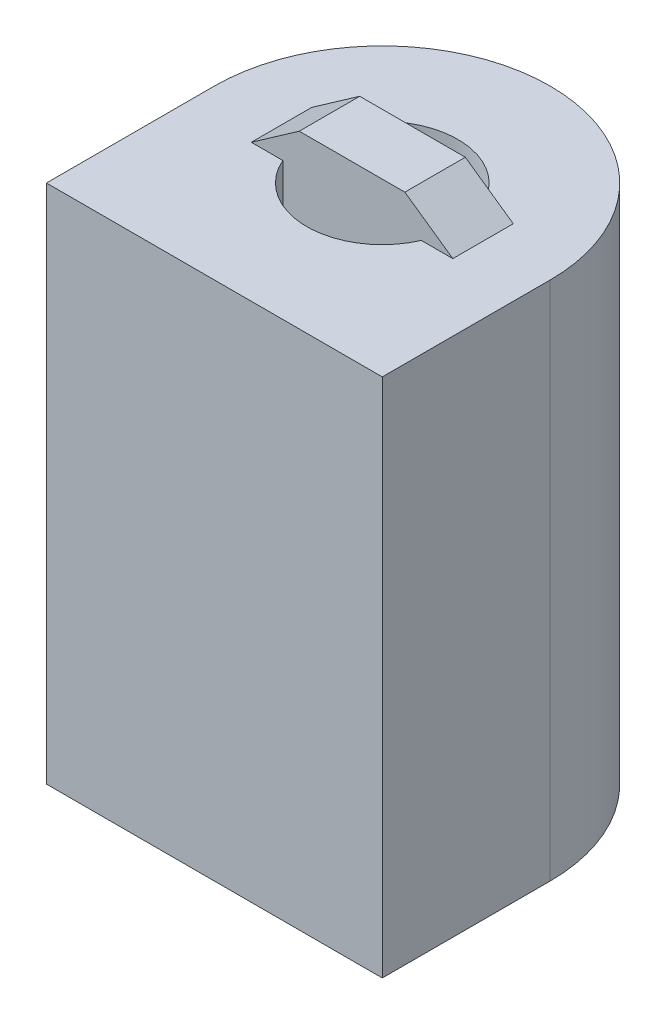
ISO-10303-21;
HEADER;
FILE_DESCRIPTION(('STEP AP214'),'2;1');
FILE_NAME('part.step','',(''),(''),'','','');
FILE_SCHEMA(('AUTOMOTIVE_DESIGN { 1 0 10303 214 1 1 1 1 }'));
ENDSEC;
DATA;
#1=APPLICATION_CONTEXT('core data for automotive mechanical design processes');
#2=APPLICATION_PROTOCOL_DEFINITION('international standard','automotive_design',2000,#1);
#3=PRODUCT_CONTEXT('',#1,'mechanical');
#4=PRODUCT('Part','Part','',(#3));
#5=PRODUCT_RELATED_PRODUCT_CATEGORY('part','',(#4));
#6=PRODUCT_DEFINITION_FORMATION('','',#4);
#7=PRODUCT_DEFINITION_CONTEXT('part definition',#1,'design');
#8=PRODUCT_DEFINITION('design','',#6,#7);
#9=PRODUCT_DEFINITION_SHAPE('','',#8);
#10=(LENGTH_UNIT() NAMED_UNIT(*) SI_UNIT(.MILLI.,.METRE.));
#11=(NAMED_UNIT(*) PLANE_ANGLE_UNIT() SI_UNIT($,.RADIAN.));
#12=(NAMED_UNIT(*) SI_UNIT($,.STERADIAN.) SOLID_ANGLE_UNIT());
#13=UNCERTAINTY_MEASURE_WITH_UNIT(LENGTH_MEASURE(1.E-05),#10,'distance_accuracy_value','');
#14=(GEOMETRIC_REPRESENTATION_CONTEXT(3) GLOBAL_UNCERTAINTY_ASSIGNED_CONTEXT((#13)) GLOBAL_UNIT_ASSIGNED_CONTEXT((#10,
#11,#12)) REPRESENTATION_CONTEXT('',''));
#15=CARTESIAN_POINT('',(0.,0.,0.));
#16=DIRECTION('',(0.,0.,1.));
#17=DIRECTION('',(1.,0.,0.));
#18=AXIS2_PLACEMENT_3D('',#15,#16,#17);
#19=CARTESIAN_POINT('',(0.,38.1,0.));
#20=DIRECTION('',(0.,-1.,0.));
#21=DIRECTION('',(0.,0.,-1.));
#22=AXIS2_PLACEMENT_3D('',#19,#20,#21);
#23=CYLINDRICAL_SURFACE('',#22,12.7);
#24=DIRECTION('',(0.,1.,0.));
#25=VECTOR('',#24,1.);
#26=CARTESIAN_POINT('',(-12.7,-17.9605122421383,0.));
#27=LINE('',#26,#25);
#28=CARTESIAN_POINT('',(-12.7,0.,0.));
#29=VERTEX_POINT('',#28);
#30=CARTESIAN_POINT('',(-12.7,39.37,0.));
#31=VERTEX_POINT('',#30);
#32=EDGE_CURVE('E83',#29,#31,#27,.T.);
#33=ORIENTED_EDGE('',*,*,#32,.T.);
#34=CARTESIAN_POINT('',(0.,39.37,0.));
#35=DIRECTION('',(0.,1.,0.));
#36=DIRECTION('',(0.,0.,1.));
#37=AXIS2_PLACEMENT_3D('',#34,#35,#36);
#38=CIRCLE('',#37,12.7);
#39=CARTESIAN_POINT('',(12.7,39.37,0.));
#40=VERTEX_POINT('',#39);
#41=EDGE_CURVE('E270',#40,#31,#38,.T.);
#42=ORIENTED_EDGE('',*,*,#41,.F.);
#43=DIRECTION('',(0.,1.,0.));
#44=VECTOR('',#43,1.);
#45=CARTESIAN_POINT('',(12.7,-17.9605122421383,0.));
#46=LINE('',#45,#44);
#47=CARTESIAN_POINT('',(12.7,0.,0.));
#48=VERTEX_POINT('',#47);
#49=EDGE_CURVE('E164',#48,#40,#46,.T.);
#50=ORIENTED_EDGE('',*,*,#49,.F.);
#51=CARTESIAN_POINT('',(0.,0.,0.));
#52=DIRECTION('',(0.,1.,0.));
#53=DIRECTION('',(0.,0.,1.));
#54=AXIS2_PLACEMENT_3D('',#51,#52,#53);
#55=CIRCLE('',#54,12.7);
#56=EDGE_CURVE('E88',#48,#29,#55,.T.);
#57=ORIENTED_EDGE('',*,*,#56,.T.);
#58=EDGE_LOOP('',(#33,#42,#50,#57));
#59=FACE_BOUND('',#58,.T.);
#60=ADVANCED_FACE('F65',(#59),#23,.T.);
#61=CARTESIAN_POINT('',(0.,39.37,0.));
#62=DIRECTION('',(0.,1.,0.));
#63=DIRECTION('',(0.,0.,1.));
#64=AXIS2_PLACEMENT_3D('',#61,#62,#63);
#65=PLANE('',#64);
#66=ORIENTED_EDGE('',*,*,#41,.T.);
#67=DIRECTION('',(0.,0.,1.));
#68=VECTOR('',#67,1.);
#69=CARTESIAN_POINT('',(-12.7,39.37,0.));
#70=LINE('',#69,#68);
#71=CARTESIAN_POINT('',(-12.7,39.37,12.7));
#72=VERTEX_POINT('',#71);
#73=EDGE_CURVE('E174',#31,#72,#70,.T.);
#74=ORIENTED_EDGE('',*,*,#73,.T.);
#75=DIRECTION('',(1.,0.,0.));
#76=VECTOR('',#75,1.);
#77=CARTESIAN_POINT('',(0.,39.37,12.7));
#78=LINE('',#77,#76);
#79=CARTESIAN_POINT('',(12.7,39.37,12.7));
#80=VERTEX_POINT('',#79);
#81=EDGE_CURVE('E173',#72,#80,#78,.T.);
#82=ORIENTED_EDGE('',*,*,#81,.T.);
#83=DIRECTION('',(0.,0.,-1.));
#84=VECTOR('',#83,1.);
#85=CARTESIAN_POINT('',(12.7,39.37,0.));
#86=LINE('',#85,#84);
#87=EDGE_CURVE('E187',#80,#40,#86,.T.);
#88=ORIENTED_EDGE('',*,*,#87,.T.);
#89=EDGE_LOOP('',(#66,#74,#82,#88));
#90=FACE_BOUND('',#89,.T.);
#91=DIRECTION('',(0.,0.,-1.));
#92=VECTOR('',#91,1.);
#93=CARTESIAN_POINT('',(7.62,39.37,17.7362168269575));
#94=LINE('',#93,#92);
#95=CARTESIAN_POINT('',(7.62,39.37,2.286));
#96=VERTEX_POINT('',#95);
#97=CARTESIAN_POINT('',(7.62,39.37,-2.286));
#98=VERTEX_POINT('',#97);
#99=EDGE_CURVE('E221',#96,#98,#94,.T.);
#100=ORIENTED_EDGE('',*,*,#99,.F.);
#101=DIRECTION('',(-1.,0.,0.));
#102=VECTOR('',#101,1.);
#103=CARTESIAN_POINT('',(-7.62,39.37,2.286));
#104=LINE('',#103,#102);
#105=CARTESIAN_POINT('',(5.23788401933452,39.37,2.286));
#106=VERTEX_POINT('',#105);
#107=EDGE_CURVE('E76',#96,#106,#104,.T.);
#108=ORIENTED_EDGE('',*,*,#107,.T.);
#109=CARTESIAN_POINT('',(0.,39.37,0.));
#110=DIRECTION('',(0.,1.,0.));
#111=DIRECTION('',(0.,0.,1.));
#112=AXIS2_PLACEMENT_3D('',#109,#110,#111);
#113=CIRCLE('',#112,5.715);
#114=CARTESIAN_POINT('',(-5.23788401933452,39.37,2.286));
#115=VERTEX_POINT('',#114);
#116=EDGE_CURVE('E265',#115,#106,#113,.T.);
#117=ORIENTED_EDGE('',*,*,#116,.F.);
#118=CARTESIAN_POINT('',(-7.62,39.37,2.286));
#119=VERTEX_POINT('',#118);
#120=EDGE_CURVE('E12',#115,#119,#104,.T.);
#121=ORIENTED_EDGE('',*,*,#120,.T.);
#122=DIRECTION('',(0.,0.,-1.));
#123=VECTOR('',#122,1.);
#124=CARTESIAN_POINT('',(-7.62,39.37,17.7362168269575));
#125=LINE('',#124,#123);
#126=CARTESIAN_POINT('',(-7.62,39.37,-2.286));
#127=VERTEX_POINT('',#126);
#128=EDGE_CURVE('E216',#119,#127,#125,.T.);
#129=ORIENTED_EDGE('',*,*,#128,.T.);
#130=DIRECTION('',(-1.,0.,0.));
#131=VECTOR('',#130,1.);
#132=CARTESIAN_POINT('',(-7.62,39.37,-2.286));
#133=LINE('',#132,#131);
#134=CARTESIAN_POINT('',(-5.23788401933452,39.37,-2.286));
#135=VERTEX_POINT('',#134);
#136=EDGE_CURVE('E74',#135,#127,#133,.T.);
#137=ORIENTED_EDGE('',*,*,#136,.F.);
#138=CARTESIAN_POINT('',(5.23788401933452,39.37,-2.286));
#139=VERTEX_POINT('',#138);
#140=EDGE_CURVE('E269',#139,#135,#113,.T.);
#141=ORIENTED_EDGE('',*,*,#140,.F.);
#142=EDGE_CURVE('E208',#98,#139,#133,.T.);
#143=ORIENTED_EDGE('',*,*,#142,.F.);
#144=EDGE_LOOP('',(#100,#108,#117,#121,#129,#137,#141,#143));
#145=FACE_BOUND('',#144,.T.);
#146=ADVANCED_FACE('F291',(#90,#145),#65,.T.);
#147=CARTESIAN_POINT('',(0.,0.,0.));
#148=DIRECTION('',(0.,1.,0.));
#149=DIRECTION('',(0.,0.,1.));
#150=AXIS2_PLACEMENT_3D('',#147,#148,#149);
#151=CYLINDRICAL_SURFACE('',#150,5.715);
#152=ORIENTED_EDGE('',*,*,#140,.T.);
#153=DIRECTION('',(0.,1.,0.));
#154=VECTOR('',#153,1.);
#155=CARTESIAN_POINT('',(-5.23788401933452,0.,-2.286));
#156=LINE('',#155,#154);
#157=CARTESIAN_POINT('',(-5.23788401933452,33.02,-2.286));
#158=VERTEX_POINT('',#157);
#159=EDGE_CURVE('E261',#135,#158,#156,.F.);
#160=ORIENTED_EDGE('',*,*,#159,.T.);
#161=CARTESIAN_POINT('',(0.,33.02,0.));
#162=DIRECTION('',(0.,-1.,0.));
#163=DIRECTION('',(0.,0.,-1.));
#164=AXIS2_PLACEMENT_3D('',#161,#162,#163);
#165=CIRCLE('',#164,5.715);
#166=CARTESIAN_POINT('',(-5.23788401933452,33.02,2.286));
#167=VERTEX_POINT('',#166);
#168=EDGE_CURVE('E455',#158,#167,#165,.F.);
#169=ORIENTED_EDGE('',*,*,#168,.T.);
#170=DIRECTION('',(0.,1.,0.));
#171=VECTOR('',#170,1.);
#172=CARTESIAN_POINT('',(-5.23788401933452,0.,2.286));
#173=LINE('',#172,#171);
#174=EDGE_CURVE('E249',#167,#115,#173,.T.);
#175=ORIENTED_EDGE('',*,*,#174,.T.);
#176=ORIENTED_EDGE('',*,*,#116,.T.);
#177=DIRECTION('',(0.,1.,0.));
#178=VECTOR('',#177,1.);
#179=CARTESIAN_POINT('',(5.23788401933452,0.,2.286));
#180=LINE('',#179,#178);
#181=CARTESIAN_POINT('',(5.23788401933452,33.02,2.286));
#182=VERTEX_POINT('',#181);
#183=EDGE_CURVE('E253',#106,#182,#180,.F.);
#184=ORIENTED_EDGE('',*,*,#183,.T.);
#185=CARTESIAN_POINT('',(5.23788401933452,33.02,-2.286));
#186=VERTEX_POINT('',#185);
#187=EDGE_CURVE('E68',#182,#186,#165,.F.);
#188=ORIENTED_EDGE('',*,*,#187,.T.);
#189=DIRECTION('',(0.,1.,0.));
#190=VECTOR('',#189,1.);
#191=CARTESIAN_POINT('',(5.23788401933452,0.,-2.286));
#192=LINE('',#191,#190);
#193=EDGE_CURVE('E257',#186,#139,#192,.T.);
#194=ORIENTED_EDGE('',*,*,#193,.T.);
#195=EDGE_LOOP('',(#152,#160,#169,#175,#176,#184,#188,#194));
#196=FACE_BOUND('',#195,.T.);
#197=CARTESIAN_POINT('',(0.,12.7,0.));
#198=DIRECTION('',(0.,-1.,0.));
#199=DIRECTION('',(0.,0.,-1.));
#200=AXIS2_PLACEMENT_3D('',#197,#198,#199);
#201=CIRCLE('',#200,5.715);
#202=CARTESIAN_POINT('',(0.,12.7,-5.715));
#203=VERTEX_POINT('',#202);
#204=EDGE_CURVE('E278',#203,#203,#201,.F.);
#205=ORIENTED_EDGE('',*,*,#204,.F.);
#206=EDGE_LOOP('',(#205));
#207=FACE_BOUND('',#206,.T.);
#208=ADVANCED_FACE('F289',(#196,#207),#151,.F.);
#209=CARTESIAN_POINT('',(0.,0.,0.));
#210=DIRECTION('',(0.,1.,0.));
#211=DIRECTION('',(0.,0.,1.));
#212=AXIS2_PLACEMENT_3D('',#209,#210,#211);
#213=PLANE('',#212);
#214=CARTESIAN_POINT('',(0.,0.,0.));
#215=DIRECTION('',(0.,-1.,0.));
#216=DIRECTION('',(0.,0.,-1.));
#217=AXIS2_PLACEMENT_3D('',#214,#215,#216);
#218=CIRCLE('',#217,9.3345);
#219=CARTESIAN_POINT('',(0.,0.,-9.3345));
#220=VERTEX_POINT('',#219);
#221=EDGE_CURVE('E273',#220,#220,#218,.T.);
#222=ORIENTED_EDGE('',*,*,#221,.F.);
#223=EDGE_LOOP('',(#222));
#224=FACE_BOUND('',#223,.T.);
#225=ORIENTED_EDGE('',*,*,#56,.F.);
#226=DIRECTION('',(0.,0.,1.));
#227=VECTOR('',#226,1.);
#228=CARTESIAN_POINT('',(12.7,0.,0.));
#229=LINE('',#228,#227);
#230=CARTESIAN_POINT('',(12.7,0.,12.7));
#231=VERTEX_POINT('',#230);
#232=EDGE_CURVE('E159',#48,#231,#229,.T.);
#233=ORIENTED_EDGE('',*,*,#232,.T.);
#234=DIRECTION('',(-1.,0.,0.));
#235=VECTOR('',#234,1.);
#236=CARTESIAN_POINT('',(0.,0.,12.7));
#237=LINE('',#236,#235);
#238=CARTESIAN_POINT('',(-12.7,0.,12.7));
#239=VERTEX_POINT('',#238);
#240=EDGE_CURVE('E154',#231,#239,#237,.T.);
#241=ORIENTED_EDGE('',*,*,#240,.T.);
#242=DIRECTION('',(0.,0.,-1.));
#243=VECTOR('',#242,1.);
#244=CARTESIAN_POINT('',(-12.7,0.,0.));
#245=LINE('',#244,#243);
#246=EDGE_CURVE('E157',#239,#29,#245,.T.);
#247=ORIENTED_EDGE('',*,*,#246,.T.);
#248=EDGE_LOOP('',(#225,#233,#241,#247));
#249=FACE_BOUND('',#248,.T.);
#250=ADVANCED_FACE('F156',(#224,#249),#213,.F.);
#251=CARTESIAN_POINT('',(0.,12.7,0.));
#252=DIRECTION('',(0.,-1.,0.));
#253=DIRECTION('',(0.,0.,-1.));
#254=AXIS2_PLACEMENT_3D('',#251,#252,#253);
#255=PLANE('',#254);
#256=CARTESIAN_POINT('',(0.,12.7,0.));
#257=DIRECTION('',(0.,-1.,0.));
#258=DIRECTION('',(0.,0.,-1.));
#259=AXIS2_PLACEMENT_3D('',#256,#257,#258);
#260=CIRCLE('',#259,9.3345);
#261=CARTESIAN_POINT('',(0.,12.7,-9.3345));
#262=VERTEX_POINT('',#261);
#263=EDGE_CURVE('E274',#262,#262,#260,.T.);
#264=ORIENTED_EDGE('',*,*,#263,.T.);
#265=EDGE_LOOP('',(#264));
#266=FACE_BOUND('',#265,.T.);
#267=ORIENTED_EDGE('',*,*,#204,.T.);
#268=EDGE_LOOP('',(#267));
#269=FACE_BOUND('',#268,.T.);
#270=ADVANCED_FACE('F287',(#266,#269),#255,.T.);
#271=CARTESIAN_POINT('',(0.,12.7,0.));
#272=DIRECTION('',(0.,-1.,0.));
#273=DIRECTION('',(0.,0.,-1.));
#274=AXIS2_PLACEMENT_3D('',#271,#272,#273);
#275=CYLINDRICAL_SURFACE('',#274,9.3345);
#276=ORIENTED_EDGE('',*,*,#263,.F.);
#277=EDGE_LOOP('',(#276));
#278=FACE_BOUND('',#277,.T.);
#279=ORIENTED_EDGE('',*,*,#221,.T.);
#280=EDGE_LOOP('',(#279));
#281=FACE_BOUND('',#280,.T.);
#282=ADVANCED_FACE('F414',(#278,#281),#275,.F.);
#283=CARTESIAN_POINT('',(0.,33.02,0.));
#284=DIRECTION('',(0.,-1.,0.));
#285=DIRECTION('',(0.,0.,-1.));
#286=AXIS2_PLACEMENT_3D('',#283,#284,#285);
#287=PLANE('',#286);
#288=ORIENTED_EDGE('',*,*,#168,.F.);
#289=DIRECTION('',(-1.,0.,0.));
#290=VECTOR('',#289,1.);
#291=CARTESIAN_POINT('',(5.715,33.02,-2.286));
#292=LINE('',#291,#290);
#293=EDGE_CURVE('E245',#186,#158,#292,.T.);
#294=ORIENTED_EDGE('',*,*,#293,.F.);
#295=ORIENTED_EDGE('',*,*,#187,.F.);
#296=DIRECTION('',(1.,0.,0.));
#297=VECTOR('',#296,1.);
#298=CARTESIAN_POINT('',(5.715,33.02,2.286));
#299=LINE('',#298,#297);
#300=EDGE_CURVE('E241',#167,#182,#299,.T.);
#301=ORIENTED_EDGE('',*,*,#300,.F.);
#302=EDGE_LOOP('',(#288,#294,#295,#301));
#303=FACE_BOUND('',#302,.T.);
#304=ADVANCED_FACE('F406',(#303),#287,.T.);
#305=CARTESIAN_POINT('',(5.715,33.02,-2.286));
#306=DIRECTION('',(0.,0.,-1.));
#307=DIRECTION('',(-1.,0.,0.));
#308=AXIS2_PLACEMENT_3D('',#305,#306,#307);
#309=PLANE('',#308);
#310=ORIENTED_EDGE('',*,*,#159,.F.);
#311=ORIENTED_EDGE('',*,*,#136,.T.);
#312=DIRECTION('',(0.819152044288995,0.573576436351041,0.));
#313=VECTOR('',#312,1.);
#314=CARTESIAN_POINT('',(-3.99250406287499,41.91,-2.286));
#315=LINE('',#314,#313);
#316=CARTESIAN_POINT('',(-3.99250406287499,41.91,-2.286));
#317=VERTEX_POINT('',#316);
#318=EDGE_CURVE('E204',#127,#317,#315,.T.);
#319=ORIENTED_EDGE('',*,*,#318,.T.);
#320=DIRECTION('',(1.,0.,0.));
#321=VECTOR('',#320,1.);
#322=CARTESIAN_POINT('',(3.99250406287499,41.91,-2.286));
#323=LINE('',#322,#321);
#324=CARTESIAN_POINT('',(3.99250406287499,41.91,-2.286));
#325=VERTEX_POINT('',#324);
#326=EDGE_CURVE('E200',#317,#325,#323,.T.);
#327=ORIENTED_EDGE('',*,*,#326,.T.);
#328=DIRECTION('',(0.819152044288995,-0.573576436351042,0.));
#329=VECTOR('',#328,1.);
#330=CARTESIAN_POINT('',(7.62,39.37,-2.286));
#331=LINE('',#330,#329);
#332=EDGE_CURVE('E199',#325,#98,#331,.T.);
#333=ORIENTED_EDGE('',*,*,#332,.T.);
#334=ORIENTED_EDGE('',*,*,#142,.T.);
#335=ORIENTED_EDGE('',*,*,#193,.F.);
#336=ORIENTED_EDGE('',*,*,#293,.T.);
#337=EDGE_LOOP('',(#310,#311,#319,#327,#333,#334,#335,#336));
#338=FACE_BOUND('',#337,.T.);
#339=ADVANCED_FACE('F398',(#338),#309,.T.);
#340=CARTESIAN_POINT('',(5.715,33.02,2.286));
#341=DIRECTION('',(0.,0.,1.));
#342=DIRECTION('',(1.,0.,0.));
#343=AXIS2_PLACEMENT_3D('',#340,#341,#342);
#344=PLANE('',#343);
#345=ORIENTED_EDGE('',*,*,#183,.F.);
#346=ORIENTED_EDGE('',*,*,#107,.F.);
#347=DIRECTION('',(0.819152044288995,-0.573576436351042,0.));
#348=VECTOR('',#347,1.);
#349=CARTESIAN_POINT('',(7.62,39.37,2.286));
#350=LINE('',#349,#348);
#351=CARTESIAN_POINT('',(3.99250406287499,41.91,2.286));
#352=VERTEX_POINT('',#351);
#353=EDGE_CURVE('E217',#352,#96,#350,.T.);
#354=ORIENTED_EDGE('',*,*,#353,.F.);
#355=DIRECTION('',(1.,0.,0.));
#356=VECTOR('',#355,1.);
#357=CARTESIAN_POINT('',(3.99250406287499,41.91,2.286));
#358=LINE('',#357,#356);
#359=CARTESIAN_POINT('',(-3.99250406287499,41.91,2.286));
#360=VERTEX_POINT('',#359);
#361=EDGE_CURVE('E223',#360,#352,#358,.T.);
#362=ORIENTED_EDGE('',*,*,#361,.F.);
#363=DIRECTION('',(0.819152044288995,0.573576436351042,0.));
#364=VECTOR('',#363,1.);
#365=CARTESIAN_POINT('',(-3.99250406287499,41.91,2.286));
#366=LINE('',#365,#364);
#367=EDGE_CURVE('E228',#119,#360,#366,.T.);
#368=ORIENTED_EDGE('',*,*,#367,.F.);
#369=ORIENTED_EDGE('',*,*,#120,.F.);
#370=ORIENTED_EDGE('',*,*,#174,.F.);
#371=ORIENTED_EDGE('',*,*,#300,.T.);
#372=EDGE_LOOP('',(#345,#346,#354,#362,#368,#369,#370,#371));
#373=FACE_BOUND('',#372,.T.);
#374=ADVANCED_FACE('F379',(#373),#344,.T.);
#375=CARTESIAN_POINT('',(-3.99250406287499,41.91,17.7362168269575));
#376=DIRECTION('',(-0.573576436351041,0.819152044288995,0.));
#377=DIRECTION('',(-0.819152044288995,-0.573576436351042,0.));
#378=AXIS2_PLACEMENT_3D('',#375,#376,#377);
#379=PLANE('',#378);
#380=ORIENTED_EDGE('',*,*,#128,.F.);
#381=ORIENTED_EDGE('',*,*,#367,.T.);
#382=DIRECTION('',(0.,0.,-1.));
#383=VECTOR('',#382,1.);
#384=CARTESIAN_POINT('',(-3.99250406287499,41.91,17.7362168269575));
#385=LINE('',#384,#383);
#386=EDGE_CURVE('E227',#360,#317,#385,.T.);
#387=ORIENTED_EDGE('',*,*,#386,.T.);
#388=ORIENTED_EDGE('',*,*,#318,.F.);
#389=EDGE_LOOP('',(#380,#381,#387,#388));
#390=FACE_BOUND('',#389,.T.);
#391=ADVANCED_FACE('F370',(#390),#379,.T.);
#392=CARTESIAN_POINT('',(3.99250406287499,41.91,17.7362168269575));
#393=DIRECTION('',(0.,1.,0.));
#394=DIRECTION('',(0.,0.,1.));
#395=AXIS2_PLACEMENT_3D('',#392,#393,#394);
#396=PLANE('',#395);
#397=ORIENTED_EDGE('',*,*,#386,.F.);
#398=ORIENTED_EDGE('',*,*,#361,.T.);
#399=DIRECTION('',(0.,0.,-1.));
#400=VECTOR('',#399,1.);
#401=CARTESIAN_POINT('',(3.99250406287499,41.91,17.7362168269575));
#402=LINE('',#401,#400);
#403=EDGE_CURVE('E222',#352,#325,#402,.T.);
#404=ORIENTED_EDGE('',*,*,#403,.T.);
#405=ORIENTED_EDGE('',*,*,#326,.F.);
#406=EDGE_LOOP('',(#397,#398,#404,#405));
#407=FACE_BOUND('',#406,.T.);
#408=ADVANCED_FACE('F362',(#407),#396,.T.);
#409=CARTESIAN_POINT('',(7.62,39.37,17.7362168269575));
#410=DIRECTION('',(0.573576436351042,0.819152044288995,0.));
#411=DIRECTION('',(-0.819152044288995,0.573576436351042,0.));
#412=AXIS2_PLACEMENT_3D('',#409,#410,#411);
#413=PLANE('',#412);
#414=ORIENTED_EDGE('',*,*,#403,.F.);
#415=ORIENTED_EDGE('',*,*,#353,.T.);
#416=ORIENTED_EDGE('',*,*,#99,.T.);
#417=ORIENTED_EDGE('',*,*,#332,.F.);
#418=EDGE_LOOP('',(#414,#415,#416,#417));
#419=FACE_BOUND('',#418,.T.);
#420=ADVANCED_FACE('F313',(#419),#413,.T.);
#421=CARTESIAN_POINT('',(0.,-17.9605122421383,12.7));
#422=DIRECTION('',(0.,0.,1.));
#423=DIRECTION('',(1.,0.,0.));
#424=AXIS2_PLACEMENT_3D('',#421,#422,#423);
#425=PLANE('',#424);
#426=ORIENTED_EDGE('',*,*,#240,.F.);
#427=DIRECTION('',(0.,1.,0.));
#428=VECTOR('',#427,1.);
#429=CARTESIAN_POINT('',(12.7,-17.9605122421383,12.7));
#430=LINE('',#429,#428);
#431=EDGE_CURVE('E191',#231,#80,#430,.T.);
#432=ORIENTED_EDGE('',*,*,#431,.T.);
#433=ORIENTED_EDGE('',*,*,#81,.F.);
#434=DIRECTION('',(0.,1.,0.));
#435=VECTOR('',#434,1.);
#436=CARTESIAN_POINT('',(-12.7,-17.9605122421383,12.7));
#437=LINE('',#436,#435);
#438=EDGE_CURVE('E170',#239,#72,#437,.T.);
#439=ORIENTED_EDGE('',*,*,#438,.F.);
#440=EDGE_LOOP('',(#426,#432,#433,#439));
#441=FACE_BOUND('',#440,.T.);
#442=ADVANCED_FACE('F176',(#441),#425,.T.);
#443=CARTESIAN_POINT('',(12.7,-17.9605122421383,0.));
#444=DIRECTION('',(1.,0.,0.));
#445=DIRECTION('',(0.,0.,-1.));
#446=AXIS2_PLACEMENT_3D('',#443,#444,#445);
#447=PLANE('',#446);
#448=ORIENTED_EDGE('',*,*,#232,.F.);
#449=ORIENTED_EDGE('',*,*,#49,.T.);
#450=ORIENTED_EDGE('',*,*,#87,.F.);
#451=ORIENTED_EDGE('',*,*,#431,.F.);
#452=EDGE_LOOP('',(#448,#449,#450,#451));
#453=FACE_BOUND('',#452,.T.);
#454=ADVANCED_FACE('F331',(#453),#447,.T.);
#455=CARTESIAN_POINT('',(-12.7,-17.9605122421383,0.));
#456=DIRECTION('',(-1.,0.,0.));
#457=DIRECTION('',(0.,0.,1.));
#458=AXIS2_PLACEMENT_3D('',#455,#456,#457);
#459=PLANE('',#458);
#460=ORIENTED_EDGE('',*,*,#246,.F.);
#461=ORIENTED_EDGE('',*,*,#438,.T.);
#462=ORIENTED_EDGE('',*,*,#73,.F.);
#463=ORIENTED_EDGE('',*,*,#32,.F.);
#464=EDGE_LOOP('',(#460,#461,#462,#463));
#465=FACE_BOUND('',#464,.T.);
#466=ADVANCED_FACE('F168',(#465),#459,.T.);
#467=CLOSED_SHELL('',(#60,#146,#208,#250,#270,#282,#304,#339,#374,#391,#408,#420,#442,#454,#466));
#468=MANIFOLD_SOLID_BREP('B2',#467);
#469=ADVANCED_BREP_SHAPE_REPRESENTATION('',(#18,#468),#14);
#470=SHAPE_DEFINITION_REPRESENTATION(#9,#469);
ENDSEC;
END-ISO-10303-21;
